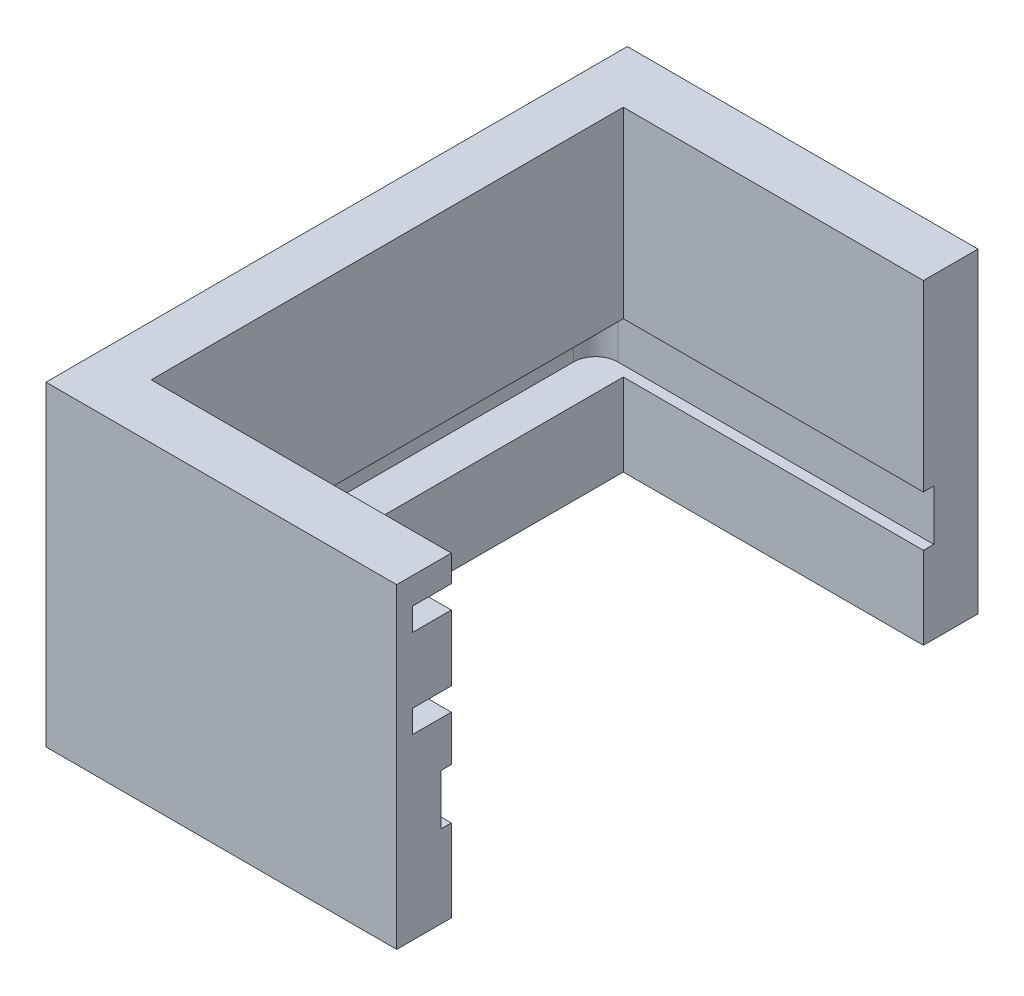
ISO-10303-21;
HEADER;
FILE_DESCRIPTION(('STEP AP214'),'2;1');
FILE_NAME('part.step','',(''),(''),'','','');
FILE_SCHEMA(('AUTOMOTIVE_DESIGN { 1 0 10303 214 1 1 1 1 }'));
ENDSEC;
DATA;
#1=APPLICATION_CONTEXT('core data for automotive mechanical design processes');
#2=APPLICATION_PROTOCOL_DEFINITION('international standard','automotive_design',2000,#1);
#3=PRODUCT_CONTEXT('',#1,'mechanical');
#4=PRODUCT('Part','Part','',(#3));
#5=PRODUCT_RELATED_PRODUCT_CATEGORY('part','',(#4));
#6=PRODUCT_DEFINITION_FORMATION('','',#4);
#7=PRODUCT_DEFINITION_CONTEXT('part definition',#1,'design');
#8=PRODUCT_DEFINITION('design','',#6,#7);
#9=PRODUCT_DEFINITION_SHAPE('','',#8);
#10=(LENGTH_UNIT() NAMED_UNIT(*) SI_UNIT(.MILLI.,.METRE.));
#11=(NAMED_UNIT(*) PLANE_ANGLE_UNIT() SI_UNIT($,.RADIAN.));
#12=(NAMED_UNIT(*) SI_UNIT($,.STERADIAN.) SOLID_ANGLE_UNIT());
#13=UNCERTAINTY_MEASURE_WITH_UNIT(LENGTH_MEASURE(1.E-05),#10,'distance_accuracy_value','');
#14=(GEOMETRIC_REPRESENTATION_CONTEXT(3) GLOBAL_UNCERTAINTY_ASSIGNED_CONTEXT((#13)) GLOBAL_UNIT_ASSIGNED_CONTEXT((#10,
#11,#12)) REPRESENTATION_CONTEXT('',''));
#15=CARTESIAN_POINT('',(0.,0.,0.));
#16=DIRECTION('',(0.,0.,1.));
#17=DIRECTION('',(1.,0.,0.));
#18=AXIS2_PLACEMENT_3D('',#15,#16,#17);
#19=CARTESIAN_POINT('',(27.75,15.9,35.3458240749704));
#20=DIRECTION('',(0.,1.,0.));
#21=DIRECTION('',(0.,0.,1.));
#22=AXIS2_PLACEMENT_3D('',#19,#20,#21);
#23=PLANE('',#22);
#24=DIRECTION('',(-1.,0.,0.));
#25=VECTOR('',#24,1.);
#26=CARTESIAN_POINT('',(27.75,15.9,44.75));
#27=LINE('',#26,#25);
#28=CARTESIAN_POINT('',(27.75,15.9,44.75));
#29=VERTEX_POINT('',#28);
#30=CARTESIAN_POINT('',(22.,15.9,44.75));
#31=VERTEX_POINT('',#30);
#32=EDGE_CURVE('E282',#29,#31,#27,.T.);
#33=ORIENTED_EDGE('',*,*,#32,.T.);
#34=DIRECTION('',(0.,0.,1.));
#35=VECTOR('',#34,1.);
#36=CARTESIAN_POINT('',(22.,15.9,35.3458240749704));
#37=LINE('',#36,#35);
#38=CARTESIAN_POINT('',(22.,15.9,41.6770956692081));
#39=VERTEX_POINT('',#38);
#40=EDGE_CURVE('E293',#39,#31,#37,.T.);
#41=ORIENTED_EDGE('',*,*,#40,.F.);
#42=DIRECTION('',(1.,0.,0.));
#43=VECTOR('',#42,1.);
#44=CARTESIAN_POINT('',(27.75,15.9,41.6770956692081));
#45=LINE('',#44,#43);
#46=CARTESIAN_POINT('',(27.75,15.9,41.6770956692081));
#47=VERTEX_POINT('',#46);
#48=EDGE_CURVE('E300',#39,#47,#45,.T.);
#49=ORIENTED_EDGE('',*,*,#48,.T.);
#50=DIRECTION('',(0.,0.,1.));
#51=VECTOR('',#50,1.);
#52=CARTESIAN_POINT('',(27.75,15.9,35.3458240749704));
#53=LINE('',#52,#51);
#54=EDGE_CURVE('E60',#47,#29,#53,.T.);
#55=ORIENTED_EDGE('',*,*,#54,.T.);
#56=EDGE_LOOP('',(#33,#41,#49,#55));
#57=FACE_BOUND('',#56,.T.);
#58=ADVANCED_FACE('F45',(#57),#23,.F.);
#59=CARTESIAN_POINT('',(27.75,14.1,35.3458240749704));
#60=DIRECTION('',(0.,-1.,0.));
#61=DIRECTION('',(0.,0.,-1.));
#62=AXIS2_PLACEMENT_3D('',#59,#60,#61);
#63=PLANE('',#62);
#64=DIRECTION('',(-1.,0.,0.));
#65=VECTOR('',#64,1.);
#66=CARTESIAN_POINT('',(27.75,14.1,41.6770956692081));
#67=LINE('',#66,#65);
#68=CARTESIAN_POINT('',(27.75,14.1,41.6770956692081));
#69=VERTEX_POINT('',#68);
#70=CARTESIAN_POINT('',(24.46,14.1,41.6770956692081));
#71=VERTEX_POINT('',#70);
#72=EDGE_CURVE('E274',#69,#71,#67,.T.);
#73=ORIENTED_EDGE('',*,*,#72,.T.);
#74=DIRECTION('',(0.,0.,-1.));
#75=VECTOR('',#74,1.);
#76=CARTESIAN_POINT('',(24.46,14.1,45.6131338250816));
#77=LINE('',#76,#75);
#78=CARTESIAN_POINT('',(24.46,14.1,44.75));
#79=VERTEX_POINT('',#78);
#80=EDGE_CURVE('E264',#79,#71,#77,.T.);
#81=ORIENTED_EDGE('',*,*,#80,.F.);
#82=DIRECTION('',(1.,0.,0.));
#83=VECTOR('',#82,1.);
#84=CARTESIAN_POINT('',(24.31,14.1,44.75));
#85=LINE('',#84,#83);
#86=CARTESIAN_POINT('',(27.75,14.1,44.75));
#87=VERTEX_POINT('',#86);
#88=EDGE_CURVE('E68',#79,#87,#85,.T.);
#89=ORIENTED_EDGE('',*,*,#88,.T.);
#90=DIRECTION('',(0.,0.,1.));
#91=VECTOR('',#90,1.);
#92=CARTESIAN_POINT('',(27.75,14.1,35.3458240749704));
#93=LINE('',#92,#91);
#94=EDGE_CURVE('E304',#69,#87,#93,.T.);
#95=ORIENTED_EDGE('',*,*,#94,.F.);
#96=EDGE_LOOP('',(#73,#81,#89,#95));
#97=FACE_BOUND('',#96,.T.);
#98=ADVANCED_FACE('F272',(#97),#63,.F.);
#99=CARTESIAN_POINT('',(24.31,13.25,35.3458240749704));
#100=DIRECTION('',(0.,-1.,0.));
#101=DIRECTION('',(0.,0.,-1.));
#102=AXIS2_PLACEMENT_3D('',#99,#100,#101);
#103=PLANE('',#102);
#104=DIRECTION('',(1.,0.,0.));
#105=VECTOR('',#104,1.);
#106=CARTESIAN_POINT('',(23.86,13.25,44.75));
#107=LINE('',#106,#105);
#108=CARTESIAN_POINT('',(23.86,13.25,44.75));
#109=VERTEX_POINT('',#108);
#110=CARTESIAN_POINT('',(24.46,13.25,44.75));
#111=VERTEX_POINT('',#110);
#112=EDGE_CURVE('E291',#109,#111,#107,.T.);
#113=ORIENTED_EDGE('',*,*,#112,.T.);
#114=DIRECTION('',(0.,0.,-1.));
#115=VECTOR('',#114,1.);
#116=CARTESIAN_POINT('',(24.46,13.25,45.6131338250816));
#117=LINE('',#116,#115);
#118=CARTESIAN_POINT('',(24.46,13.25,41.6770956692081));
#119=VERTEX_POINT('',#118);
#120=EDGE_CURVE('E267',#111,#119,#117,.T.);
#121=ORIENTED_EDGE('',*,*,#120,.T.);
#122=DIRECTION('',(-1.,0.,0.));
#123=VECTOR('',#122,1.);
#124=CARTESIAN_POINT('',(24.31,13.25,41.6770956692081));
#125=LINE('',#124,#123);
#126=CARTESIAN_POINT('',(23.86,13.25,41.6770956692081));
#127=VERTEX_POINT('',#126);
#128=EDGE_CURVE('E297',#119,#127,#125,.T.);
#129=ORIENTED_EDGE('',*,*,#128,.T.);
#130=DIRECTION('',(0.,0.,1.));
#131=VECTOR('',#130,1.);
#132=CARTESIAN_POINT('',(23.86,13.25,35.3458240749704));
#133=LINE('',#132,#131);
#134=EDGE_CURVE('E306',#127,#109,#133,.T.);
#135=ORIENTED_EDGE('',*,*,#134,.T.);
#136=EDGE_LOOP('',(#113,#121,#129,#135));
#137=FACE_BOUND('',#136,.T.);
#138=ADVANCED_FACE('F630',(#137),#103,.F.);
#139=CARTESIAN_POINT('',(23.86,13.25,35.3458240749704));
#140=DIRECTION('',(-0.41564419471729,-0.909527296675484,0.));
#141=DIRECTION('',(0.909527296675485,-0.415644194717291,0.));
#142=AXIS2_PLACEMENT_3D('',#139,#140,#141);
#143=PLANE('',#142);
#144=DIRECTION('',(0.909527296675485,-0.415644194717291,0.));
#145=VECTOR('',#144,1.);
#146=CARTESIAN_POINT('',(22.,14.1,44.75));
#147=LINE('',#146,#145);
#148=CARTESIAN_POINT('',(22.,14.1,44.75));
#149=VERTEX_POINT('',#148);
#150=EDGE_CURVE('E289',#149,#109,#147,.T.);
#151=ORIENTED_EDGE('',*,*,#150,.T.);
#152=ORIENTED_EDGE('',*,*,#134,.F.);
#153=DIRECTION('',(-0.909527296675485,0.415644194717291,0.));
#154=VECTOR('',#153,1.);
#155=CARTESIAN_POINT('',(23.86,13.25,41.6770956692081));
#156=LINE('',#155,#154);
#157=CARTESIAN_POINT('',(22.,14.1,41.6770956692081));
#158=VERTEX_POINT('',#157);
#159=EDGE_CURVE('E294',#127,#158,#156,.T.);
#160=ORIENTED_EDGE('',*,*,#159,.T.);
#161=DIRECTION('',(0.,0.,1.));
#162=VECTOR('',#161,1.);
#163=CARTESIAN_POINT('',(22.,14.1,35.3458240749704));
#164=LINE('',#163,#162);
#165=EDGE_CURVE('E309',#158,#149,#164,.T.);
#166=ORIENTED_EDGE('',*,*,#165,.T.);
#167=EDGE_LOOP('',(#151,#152,#160,#166));
#168=FACE_BOUND('',#167,.T.);
#169=ADVANCED_FACE('F637',(#168),#143,.F.);
#170=CARTESIAN_POINT('',(22.,15.9,35.3458240749704));
#171=DIRECTION('',(-1.,0.,0.));
#172=DIRECTION('',(0.,0.,1.));
#173=AXIS2_PLACEMENT_3D('',#170,#171,#172);
#174=PLANE('',#173);
#175=DIRECTION('',(0.,-1.,0.));
#176=VECTOR('',#175,1.);
#177=CARTESIAN_POINT('',(22.,15.9,44.75));
#178=LINE('',#177,#176);
#179=EDGE_CURVE('E287',#31,#149,#178,.T.);
#180=ORIENTED_EDGE('',*,*,#179,.T.);
#181=ORIENTED_EDGE('',*,*,#165,.F.);
#182=DIRECTION('',(0.,1.,0.));
#183=VECTOR('',#182,1.);
#184=CARTESIAN_POINT('',(22.,15.9,41.6770956692081));
#185=LINE('',#184,#183);
#186=EDGE_CURVE('E302',#158,#39,#185,.T.);
#187=ORIENTED_EDGE('',*,*,#186,.T.);
#188=ORIENTED_EDGE('',*,*,#40,.T.);
#189=EDGE_LOOP('',(#180,#181,#187,#188));
#190=FACE_BOUND('',#189,.T.);
#191=ADVANCED_FACE('F641',(#190),#174,.F.);
#192=CARTESIAN_POINT('',(27.75,22.9,35.3458240749704));
#193=DIRECTION('',(0.,1.,0.));
#194=DIRECTION('',(0.,0.,1.));
#195=AXIS2_PLACEMENT_3D('',#192,#193,#194);
#196=PLANE('',#195);
#197=DIRECTION('',(-1.,0.,0.));
#198=VECTOR('',#197,1.);
#199=CARTESIAN_POINT('',(27.75,22.9,44.75));
#200=LINE('',#199,#198);
#201=CARTESIAN_POINT('',(27.75,22.9,44.75));
#202=VERTEX_POINT('',#201);
#203=CARTESIAN_POINT('',(22.,22.9,44.75));
#204=VERTEX_POINT('',#203);
#205=EDGE_CURVE('E331',#202,#204,#200,.T.);
#206=ORIENTED_EDGE('',*,*,#205,.T.);
#207=DIRECTION('',(0.,0.,1.));
#208=VECTOR('',#207,1.);
#209=CARTESIAN_POINT('',(22.,22.9,35.3458240749704));
#210=LINE('',#209,#208);
#211=CARTESIAN_POINT('',(22.,22.9,41.6770956692081));
#212=VERTEX_POINT('',#211);
#213=EDGE_CURVE('E339',#212,#204,#210,.T.);
#214=ORIENTED_EDGE('',*,*,#213,.F.);
#215=DIRECTION('',(1.,0.,0.));
#216=VECTOR('',#215,1.);
#217=CARTESIAN_POINT('',(27.75,22.9,41.6770956692081));
#218=LINE('',#217,#216);
#219=CARTESIAN_POINT('',(27.75,22.9,41.6770956692081));
#220=VERTEX_POINT('',#219);
#221=EDGE_CURVE('E349',#212,#220,#218,.T.);
#222=ORIENTED_EDGE('',*,*,#221,.T.);
#223=DIRECTION('',(0.,0.,1.));
#224=VECTOR('',#223,1.);
#225=CARTESIAN_POINT('',(27.75,22.9,35.3458240749704));
#226=LINE('',#225,#224);
#227=EDGE_CURVE('E344',#220,#202,#226,.T.);
#228=ORIENTED_EDGE('',*,*,#227,.T.);
#229=EDGE_LOOP('',(#206,#214,#222,#228));
#230=FACE_BOUND('',#229,.T.);
#231=ADVANCED_FACE('F606',(#230),#196,.F.);
#232=CARTESIAN_POINT('',(27.75,21.1,35.3458240749704));
#233=DIRECTION('',(0.,-1.,0.));
#234=DIRECTION('',(0.,0.,-1.));
#235=AXIS2_PLACEMENT_3D('',#232,#233,#234);
#236=PLANE('',#235);
#237=DIRECTION('',(-1.,0.,0.));
#238=VECTOR('',#237,1.);
#239=CARTESIAN_POINT('',(27.75,21.1,41.6770956692081));
#240=LINE('',#239,#238);
#241=CARTESIAN_POINT('',(27.75,21.1,41.6770956692081));
#242=VERTEX_POINT('',#241);
#243=CARTESIAN_POINT('',(24.46,21.1,41.6770956692081));
#244=VERTEX_POINT('',#243);
#245=EDGE_CURVE('E346',#242,#244,#240,.T.);
#246=ORIENTED_EDGE('',*,*,#245,.T.);
#247=DIRECTION('',(0.,0.,-1.));
#248=VECTOR('',#247,1.);
#249=CARTESIAN_POINT('',(24.46,21.1,45.6131338250816));
#250=LINE('',#249,#248);
#251=CARTESIAN_POINT('',(24.46,21.1,44.75));
#252=VERTEX_POINT('',#251);
#253=EDGE_CURVE('E318',#252,#244,#250,.T.);
#254=ORIENTED_EDGE('',*,*,#253,.F.);
#255=DIRECTION('',(1.,0.,0.));
#256=VECTOR('',#255,1.);
#257=CARTESIAN_POINT('',(24.31,21.1,44.75));
#258=LINE('',#257,#256);
#259=CARTESIAN_POINT('',(27.75,21.1,44.75));
#260=VERTEX_POINT('',#259);
#261=EDGE_CURVE('E325',#252,#260,#258,.T.);
#262=ORIENTED_EDGE('',*,*,#261,.T.);
#263=DIRECTION('',(0.,0.,1.));
#264=VECTOR('',#263,1.);
#265=CARTESIAN_POINT('',(27.75,21.1,35.3458240749704));
#266=LINE('',#265,#264);
#267=EDGE_CURVE('E353',#242,#260,#266,.T.);
#268=ORIENTED_EDGE('',*,*,#267,.F.);
#269=EDGE_LOOP('',(#246,#254,#262,#268));
#270=FACE_BOUND('',#269,.T.);
#271=ADVANCED_FACE('F590',(#270),#236,.F.);
#272=CARTESIAN_POINT('',(24.31,20.25,35.3458240749704));
#273=DIRECTION('',(0.,-1.,0.));
#274=DIRECTION('',(0.,0.,-1.));
#275=AXIS2_PLACEMENT_3D('',#272,#273,#274);
#276=PLANE('',#275);
#277=DIRECTION('',(1.,0.,0.));
#278=VECTOR('',#277,1.);
#279=CARTESIAN_POINT('',(23.86,20.25,44.75));
#280=LINE('',#279,#278);
#281=CARTESIAN_POINT('',(23.86,20.25,44.75));
#282=VERTEX_POINT('',#281);
#283=CARTESIAN_POINT('',(24.46,20.25,44.75));
#284=VERTEX_POINT('',#283);
#285=EDGE_CURVE('E337',#282,#284,#280,.T.);
#286=ORIENTED_EDGE('',*,*,#285,.T.);
#287=DIRECTION('',(0.,0.,-1.));
#288=VECTOR('',#287,1.);
#289=CARTESIAN_POINT('',(24.46,20.25,45.6131338250816));
#290=LINE('',#289,#288);
#291=CARTESIAN_POINT('',(24.46,20.25,41.6770956692081));
#292=VERTEX_POINT('',#291);
#293=EDGE_CURVE('E322',#284,#292,#290,.T.);
#294=ORIENTED_EDGE('',*,*,#293,.T.);
#295=DIRECTION('',(-1.,0.,0.));
#296=VECTOR('',#295,1.);
#297=CARTESIAN_POINT('',(24.31,20.25,41.6770956692081));
#298=LINE('',#297,#296);
#299=CARTESIAN_POINT('',(23.86,20.25,41.6770956692081));
#300=VERTEX_POINT('',#299);
#301=EDGE_CURVE('E343',#292,#300,#298,.T.);
#302=ORIENTED_EDGE('',*,*,#301,.T.);
#303=DIRECTION('',(0.,0.,1.));
#304=VECTOR('',#303,1.);
#305=CARTESIAN_POINT('',(23.86,20.25,35.3458240749704));
#306=LINE('',#305,#304);
#307=EDGE_CURVE('E356',#300,#282,#306,.T.);
#308=ORIENTED_EDGE('',*,*,#307,.T.);
#309=EDGE_LOOP('',(#286,#294,#302,#308));
#310=FACE_BOUND('',#309,.T.);
#311=ADVANCED_FACE('F614',(#310),#276,.F.);
#312=CARTESIAN_POINT('',(23.86,20.25,35.3458240749704));
#313=DIRECTION('',(-0.41564419471729,-0.909527296675484,0.));
#314=DIRECTION('',(0.909527296675485,-0.415644194717291,0.));
#315=AXIS2_PLACEMENT_3D('',#312,#313,#314);
#316=PLANE('',#315);
#317=DIRECTION('',(0.909527296675485,-0.415644194717291,0.));
#318=VECTOR('',#317,1.);
#319=CARTESIAN_POINT('',(22.,21.1,44.75));
#320=LINE('',#319,#318);
#321=CARTESIAN_POINT('',(22.,21.1,44.75));
#322=VERTEX_POINT('',#321);
#323=EDGE_CURVE('E335',#322,#282,#320,.T.);
#324=ORIENTED_EDGE('',*,*,#323,.T.);
#325=ORIENTED_EDGE('',*,*,#307,.F.);
#326=DIRECTION('',(-0.909527296675485,0.415644194717291,0.));
#327=VECTOR('',#326,1.);
#328=CARTESIAN_POINT('',(23.86,20.25,41.6770956692081));
#329=LINE('',#328,#327);
#330=CARTESIAN_POINT('',(22.,21.1,41.6770956692081));
#331=VERTEX_POINT('',#330);
#332=EDGE_CURVE('E340',#300,#331,#329,.T.);
#333=ORIENTED_EDGE('',*,*,#332,.T.);
#334=DIRECTION('',(0.,0.,1.));
#335=VECTOR('',#334,1.);
#336=CARTESIAN_POINT('',(22.,21.1,35.3458240749704));
#337=LINE('',#336,#335);
#338=EDGE_CURVE('E359',#331,#322,#337,.T.);
#339=ORIENTED_EDGE('',*,*,#338,.T.);
#340=EDGE_LOOP('',(#324,#325,#333,#339));
#341=FACE_BOUND('',#340,.T.);
#342=ADVANCED_FACE('F612',(#341),#316,.F.);
#343=CARTESIAN_POINT('',(22.,22.9,35.3458240749704));
#344=DIRECTION('',(-1.,0.,0.));
#345=DIRECTION('',(0.,0.,1.));
#346=AXIS2_PLACEMENT_3D('',#343,#344,#345);
#347=PLANE('',#346);
#348=DIRECTION('',(0.,-1.,0.));
#349=VECTOR('',#348,1.);
#350=CARTESIAN_POINT('',(22.,22.9,44.75));
#351=LINE('',#350,#349);
#352=EDGE_CURVE('E333',#204,#322,#351,.T.);
#353=ORIENTED_EDGE('',*,*,#352,.T.);
#354=ORIENTED_EDGE('',*,*,#338,.F.);
#355=DIRECTION('',(0.,1.,0.));
#356=VECTOR('',#355,1.);
#357=CARTESIAN_POINT('',(22.,22.9,41.6770956692081));
#358=LINE('',#357,#356);
#359=EDGE_CURVE('E351',#331,#212,#358,.T.);
#360=ORIENTED_EDGE('',*,*,#359,.T.);
#361=ORIENTED_EDGE('',*,*,#213,.T.);
#362=EDGE_LOOP('',(#353,#354,#360,#361));
#363=FACE_BOUND('',#362,.T.);
#364=ADVANCED_FACE('F608',(#363),#347,.F.);
#365=CARTESIAN_POINT('',(4.,0.,46.));
#366=DIRECTION('',(-1.,0.,0.));
#367=DIRECTION('',(0.,0.,1.));
#368=AXIS2_PLACEMENT_3D('',#365,#366,#367);
#369=PLANE('',#368);
#370=DIRECTION('',(0.,0.,1.));
#371=VECTOR('',#370,1.);
#372=CARTESIAN_POINT('',(4.,10.5115762542506,46.));
#373=LINE('',#372,#371);
#374=CARTESIAN_POINT('',(4.,10.5115762542506,4.31897182601304));
#375=VERTEX_POINT('',#374);
#376=CARTESIAN_POINT('',(4.,10.5115762542506,41.677095669208));
#377=VERTEX_POINT('',#376);
#378=EDGE_CURVE('E448',#375,#377,#373,.T.);
#379=ORIENTED_EDGE('',*,*,#378,.F.);
#380=DIRECTION('',(0.,1.,0.));
#381=VECTOR('',#380,1.);
#382=CARTESIAN_POINT('',(4.,-24.2307736156058,4.31897182601304));
#383=LINE('',#382,#381);
#384=CARTESIAN_POINT('',(4.,25.,4.31897182601304));
#385=VERTEX_POINT('',#384);
#386=EDGE_CURVE('E458',#375,#385,#383,.T.);
#387=ORIENTED_EDGE('',*,*,#386,.T.);
#388=DIRECTION('',(0.,0.,-1.));
#389=VECTOR('',#388,1.);
#390=CARTESIAN_POINT('',(4.,25.,46.));
#391=LINE('',#390,#389);
#392=CARTESIAN_POINT('',(4.,25.,41.677095669208));
#393=VERTEX_POINT('',#392);
#394=EDGE_CURVE('E497',#393,#385,#391,.T.);
#395=ORIENTED_EDGE('',*,*,#394,.F.);
#396=DIRECTION('',(0.,1.,0.));
#397=VECTOR('',#396,1.);
#398=CARTESIAN_POINT('',(4.,-23.7548500310989,41.677095669208));
#399=LINE('',#398,#397);
#400=EDGE_CURVE('E390',#377,#393,#399,.T.);
#401=ORIENTED_EDGE('',*,*,#400,.F.);
#402=EDGE_LOOP('',(#379,#387,#395,#401));
#403=FACE_BOUND('',#402,.T.);
#404=ADVANCED_FACE('F527',(#403),#369,.F.);
#405=CARTESIAN_POINT('',(27.75,-24.2307736156058,4.31897182601304));
#406=DIRECTION('',(0.,0.,1.));
#407=DIRECTION('',(1.,0.,0.));
#408=AXIS2_PLACEMENT_3D('',#405,#406,#407);
#409=PLANE('',#408);
#410=ORIENTED_EDGE('',*,*,#386,.F.);
#411=DIRECTION('',(1.,0.,0.));
#412=VECTOR('',#411,1.);
#413=CARTESIAN_POINT('',(27.75,10.5115762542506,4.31897182601304));
#414=LINE('',#413,#412);
#415=CARTESIAN_POINT('',(27.75,10.5115762542506,4.31897182601304));
#416=VERTEX_POINT('',#415);
#417=EDGE_CURVE('E53',#375,#416,#414,.T.);
#418=ORIENTED_EDGE('',*,*,#417,.T.);
#419=DIRECTION('',(0.,1.,0.));
#420=VECTOR('',#419,1.);
#421=CARTESIAN_POINT('',(27.75,-24.2307736156058,4.31897182601304));
#422=LINE('',#421,#420);
#423=CARTESIAN_POINT('',(27.75,25.,4.31897182601304));
#424=VERTEX_POINT('',#423);
#425=EDGE_CURVE('E462',#416,#424,#422,.T.);
#426=ORIENTED_EDGE('',*,*,#425,.T.);
#427=DIRECTION('',(1.,0.,0.));
#428=VECTOR('',#427,1.);
#429=CARTESIAN_POINT('',(27.75,25.,4.31897182601304));
#430=LINE('',#429,#428);
#431=EDGE_CURVE('E465',#385,#424,#430,.T.);
#432=ORIENTED_EDGE('',*,*,#431,.F.);
#433=EDGE_LOOP('',(#410,#418,#426,#432));
#434=FACE_BOUND('',#433,.T.);
#435=ADVANCED_FACE('F510',(#434),#409,.T.);
#436=CARTESIAN_POINT('',(4.,0.,4.31897182601304));
#437=VERTEX_POINT('',#436);
#438=CARTESIAN_POINT('',(4.,6.51157625425061,4.31897182601304));
#439=VERTEX_POINT('',#438);
#440=EDGE_CURVE('E455',#437,#439,#383,.T.);
#441=ORIENTED_EDGE('',*,*,#440,.T.);
#442=DIRECTION('',(0.,0.,1.));
#443=VECTOR('',#442,1.);
#444=CARTESIAN_POINT('',(4.,6.51157625425062,46.));
#445=LINE('',#444,#443);
#446=CARTESIAN_POINT('',(4.,6.51157625425062,41.677095669208));
#447=VERTEX_POINT('',#446);
#448=EDGE_CURVE('E446',#439,#447,#445,.T.);
#449=ORIENTED_EDGE('',*,*,#448,.T.);
#450=CARTESIAN_POINT('',(4.,0.,41.677095669208));
#451=VERTEX_POINT('',#450);
#452=EDGE_CURVE('E395',#451,#447,#399,.T.);
#453=ORIENTED_EDGE('',*,*,#452,.F.);
#454=DIRECTION('',(0.,0.,-1.));
#455=VECTOR('',#454,1.);
#456=CARTESIAN_POINT('',(4.,0.,46.));
#457=LINE('',#456,#455);
#458=EDGE_CURVE('E500',#451,#437,#457,.T.);
#459=ORIENTED_EDGE('',*,*,#458,.T.);
#460=EDGE_LOOP('',(#441,#449,#453,#459));
#461=FACE_BOUND('',#460,.T.);
#462=ADVANCED_FACE('F839',(#461),#369,.F.);
#463=CARTESIAN_POINT('',(0.,0.,46.));
#464=DIRECTION('',(1.,0.,0.));
#465=DIRECTION('',(0.,0.,-1.));
#466=AXIS2_PLACEMENT_3D('',#463,#464,#465);
#467=PLANE('',#466);
#468=DIRECTION('',(0.,-1.,0.));
#469=VECTOR('',#468,1.);
#470=CARTESIAN_POINT('',(0.,0.,0.));
#471=LINE('',#470,#469);
#472=CARTESIAN_POINT('',(0.,25.,0.));
#473=VERTEX_POINT('',#472);
#474=CARTESIAN_POINT('',(0.,0.,0.));
#475=VERTEX_POINT('',#474);
#476=EDGE_CURVE('E475',#473,#475,#471,.T.);
#477=ORIENTED_EDGE('',*,*,#476,.T.);
#478=DIRECTION('',(0.,0.,-1.));
#479=VECTOR('',#478,1.);
#480=CARTESIAN_POINT('',(0.,0.,46.));
#481=LINE('',#480,#479);
#482=CARTESIAN_POINT('',(0.,0.,46.));
#483=VERTEX_POINT('',#482);
#484=EDGE_CURVE('E502',#483,#475,#481,.T.);
#485=ORIENTED_EDGE('',*,*,#484,.F.);
#486=DIRECTION('',(0.,-1.,0.));
#487=VECTOR('',#486,1.);
#488=CARTESIAN_POINT('',(0.,0.,46.));
#489=LINE('',#488,#487);
#490=CARTESIAN_POINT('',(0.,25.,46.));
#491=VERTEX_POINT('',#490);
#492=EDGE_CURVE('E480',#491,#483,#489,.T.);
#493=ORIENTED_EDGE('',*,*,#492,.F.);
#494=DIRECTION('',(0.,0.,-1.));
#495=VECTOR('',#494,1.);
#496=CARTESIAN_POINT('',(0.,25.,46.));
#497=LINE('',#496,#495);
#498=EDGE_CURVE('E489',#491,#473,#497,.T.);
#499=ORIENTED_EDGE('',*,*,#498,.T.);
#500=EDGE_LOOP('',(#477,#485,#493,#499));
#501=FACE_BOUND('',#500,.T.);
#502=ADVANCED_FACE('F47',(#501),#467,.F.);
#503=CARTESIAN_POINT('',(0.,0.,46.));
#504=DIRECTION('',(0.,1.,0.));
#505=DIRECTION('',(0.,0.,1.));
#506=AXIS2_PLACEMENT_3D('',#503,#504,#505);
#507=PLANE('',#506);
#508=ORIENTED_EDGE('',*,*,#458,.F.);
#509=DIRECTION('',(-1.,0.,0.));
#510=VECTOR('',#509,1.);
#511=CARTESIAN_POINT('',(27.75,0.,41.6770956692081));
#512=LINE('',#511,#510);
#513=CARTESIAN_POINT('',(27.75,0.,41.6770956692081));
#514=VERTEX_POINT('',#513);
#515=EDGE_CURVE('E383',#514,#451,#512,.T.);
#516=ORIENTED_EDGE('',*,*,#515,.F.);
#517=DIRECTION('',(0.,0.,1.));
#518=VECTOR('',#517,1.);
#519=CARTESIAN_POINT('',(27.75,0.,46.));
#520=LINE('',#519,#518);
#521=CARTESIAN_POINT('',(27.75,0.,46.));
#522=VERTEX_POINT('',#521);
#523=EDGE_CURVE('E473',#514,#522,#520,.T.);
#524=ORIENTED_EDGE('',*,*,#523,.T.);
#525=DIRECTION('',(1.,0.,0.));
#526=VECTOR('',#525,1.);
#527=CARTESIAN_POINT('',(0.,0.,46.));
#528=LINE('',#527,#526);
#529=EDGE_CURVE('E483',#483,#522,#528,.T.);
#530=ORIENTED_EDGE('',*,*,#529,.F.);
#531=ORIENTED_EDGE('',*,*,#484,.T.);
#532=DIRECTION('',(1.,0.,0.));
#533=VECTOR('',#532,1.);
#534=CARTESIAN_POINT('',(0.,0.,0.));
#535=LINE('',#534,#533);
#536=CARTESIAN_POINT('',(27.75,0.,0.));
#537=VERTEX_POINT('',#536);
#538=EDGE_CURVE('E492',#475,#537,#535,.T.);
#539=ORIENTED_EDGE('',*,*,#538,.T.);
#540=DIRECTION('',(0.,0.,1.));
#541=VECTOR('',#540,1.);
#542=CARTESIAN_POINT('',(27.75,0.,3.49999999999997));
#543=LINE('',#542,#541);
#544=CARTESIAN_POINT('',(27.75,0.,4.31897182601304));
#545=VERTEX_POINT('',#544);
#546=EDGE_CURVE('E450',#537,#545,#543,.T.);
#547=ORIENTED_EDGE('',*,*,#546,.T.);
#548=DIRECTION('',(-1.,0.,0.));
#549=VECTOR('',#548,1.);
#550=CARTESIAN_POINT('',(27.75,0.,4.31897182601304));
#551=LINE('',#550,#549);
#552=EDGE_CURVE('E470',#545,#437,#551,.T.);
#553=ORIENTED_EDGE('',*,*,#552,.T.);
#554=EDGE_LOOP('',(#508,#516,#524,#530,#531,#539,#547,#553));
#555=FACE_BOUND('',#554,.T.);
#556=ADVANCED_FACE('F569',(#555),#507,.F.);
#557=CARTESIAN_POINT('',(0.,25.,46.));
#558=DIRECTION('',(0.,-1.,0.));
#559=DIRECTION('',(0.,0.,-1.));
#560=AXIS2_PLACEMENT_3D('',#557,#558,#559);
#561=PLANE('',#560);
#562=DIRECTION('',(0.,0.,-1.));
#563=VECTOR('',#562,1.);
#564=CARTESIAN_POINT('',(27.75,25.,46.));
#565=LINE('',#564,#563);
#566=CARTESIAN_POINT('',(27.75,25.,46.));
#567=VERTEX_POINT('',#566);
#568=CARTESIAN_POINT('',(27.75,25.,41.6770956692081));
#569=VERTEX_POINT('',#568);
#570=EDGE_CURVE('E468',#567,#569,#565,.T.);
#571=ORIENTED_EDGE('',*,*,#570,.T.);
#572=DIRECTION('',(1.,0.,0.));
#573=VECTOR('',#572,1.);
#574=CARTESIAN_POINT('',(27.75,25.,41.6770956692081));
#575=LINE('',#574,#573);
#576=EDGE_CURVE('E380',#393,#569,#575,.T.);
#577=ORIENTED_EDGE('',*,*,#576,.F.);
#578=ORIENTED_EDGE('',*,*,#394,.T.);
#579=ORIENTED_EDGE('',*,*,#431,.T.);
#580=DIRECTION('',(0.,0.,-1.));
#581=VECTOR('',#580,1.);
#582=CARTESIAN_POINT('',(27.75,25.,3.49999999999997));
#583=LINE('',#582,#581);
#584=CARTESIAN_POINT('',(27.75,25.,0.));
#585=VERTEX_POINT('',#584);
#586=EDGE_CURVE('E454',#424,#585,#583,.T.);
#587=ORIENTED_EDGE('',*,*,#586,.T.);
#588=DIRECTION('',(-1.,0.,0.));
#589=VECTOR('',#588,1.);
#590=CARTESIAN_POINT('',(0.,25.,0.));
#591=LINE('',#590,#589);
#592=EDGE_CURVE('E484',#585,#473,#591,.T.);
#593=ORIENTED_EDGE('',*,*,#592,.T.);
#594=ORIENTED_EDGE('',*,*,#498,.F.);
#595=DIRECTION('',(-1.,0.,0.));
#596=VECTOR('',#595,1.);
#597=CARTESIAN_POINT('',(0.,25.,46.));
#598=LINE('',#597,#596);
#599=EDGE_CURVE('E487',#567,#491,#598,.T.);
#600=ORIENTED_EDGE('',*,*,#599,.F.);
#601=EDGE_LOOP('',(#571,#577,#578,#579,#587,#593,#594,#600));
#602=FACE_BOUND('',#601,.T.);
#603=ADVANCED_FACE('F521',(#602),#561,.F.);
#604=CARTESIAN_POINT('',(0.,0.,46.));
#605=DIRECTION('',(0.,0.,-1.));
#606=DIRECTION('',(-1.,0.,0.));
#607=AXIS2_PLACEMENT_3D('',#604,#605,#606);
#608=PLANE('',#607);
#609=DIRECTION('',(0.,1.,0.));
#610=VECTOR('',#609,1.);
#611=CARTESIAN_POINT('',(27.75,-24.2307736156058,46.));
#612=LINE('',#611,#610);
#613=EDGE_CURVE('E476',#522,#567,#612,.T.);
#614=ORIENTED_EDGE('',*,*,#613,.T.);
#615=ORIENTED_EDGE('',*,*,#599,.T.);
#616=ORIENTED_EDGE('',*,*,#492,.T.);
#617=ORIENTED_EDGE('',*,*,#529,.T.);
#618=EDGE_LOOP('',(#614,#615,#616,#617));
#619=FACE_BOUND('',#618,.T.);
#620=ADVANCED_FACE('F728',(#619),#608,.F.);
#621=CARTESIAN_POINT('',(0.,0.,0.));
#622=DIRECTION('',(0.,0.,-1.));
#623=DIRECTION('',(-1.,0.,0.));
#624=AXIS2_PLACEMENT_3D('',#621,#622,#623);
#625=PLANE('',#624);
#626=ORIENTED_EDGE('',*,*,#476,.F.);
#627=ORIENTED_EDGE('',*,*,#592,.F.);
#628=DIRECTION('',(0.,1.,0.));
#629=VECTOR('',#628,1.);
#630=CARTESIAN_POINT('',(27.75,-24.2307736156058,0.));
#631=LINE('',#630,#629);
#632=EDGE_CURVE('E451',#537,#585,#631,.T.);
#633=ORIENTED_EDGE('',*,*,#632,.F.);
#634=ORIENTED_EDGE('',*,*,#538,.F.);
#635=EDGE_LOOP('',(#626,#627,#633,#634));
#636=FACE_BOUND('',#635,.T.);
#637=ADVANCED_FACE('F573',(#636),#625,.T.);
#638=CARTESIAN_POINT('',(27.75,-24.2307736156058,46.));
#639=DIRECTION('',(1.,0.,0.));
#640=DIRECTION('',(0.,0.,-1.));
#641=AXIS2_PLACEMENT_3D('',#638,#639,#640);
#642=PLANE('',#641);
#643=ORIENTED_EDGE('',*,*,#94,.T.);
#644=DIRECTION('',(0.,1.,0.));
#645=VECTOR('',#644,1.);
#646=CARTESIAN_POINT('',(27.75,14.1,44.75));
#647=LINE('',#646,#645);
#648=EDGE_CURVE('E280',#87,#29,#647,.T.);
#649=ORIENTED_EDGE('',*,*,#648,.T.);
#650=ORIENTED_EDGE('',*,*,#54,.F.);
#651=DIRECTION('',(0.,1.,0.));
#652=VECTOR('',#651,1.);
#653=CARTESIAN_POINT('',(27.75,-23.7548500310989,41.6770956692081));
#654=LINE('',#653,#652);
#655=EDGE_CURVE('E394',#47,#242,#654,.T.);
#656=ORIENTED_EDGE('',*,*,#655,.T.);
#657=ORIENTED_EDGE('',*,*,#267,.T.);
#658=DIRECTION('',(0.,1.,0.));
#659=VECTOR('',#658,1.);
#660=CARTESIAN_POINT('',(27.75,21.1,44.75));
#661=LINE('',#660,#659);
#662=EDGE_CURVE('E328',#260,#202,#661,.T.);
#663=ORIENTED_EDGE('',*,*,#662,.T.);
#664=ORIENTED_EDGE('',*,*,#227,.F.);
#665=EDGE_CURVE('E398',#220,#569,#654,.T.);
#666=ORIENTED_EDGE('',*,*,#665,.T.);
#667=ORIENTED_EDGE('',*,*,#570,.F.);
#668=ORIENTED_EDGE('',*,*,#613,.F.);
#669=ORIENTED_EDGE('',*,*,#523,.F.);
#670=CARTESIAN_POINT('',(27.75,6.51157625425062,41.6770956692081));
#671=VERTEX_POINT('',#670);
#672=EDGE_CURVE('E387',#514,#671,#654,.T.);
#673=ORIENTED_EDGE('',*,*,#672,.T.);
#674=DIRECTION('',(0.,0.,-1.));
#675=VECTOR('',#674,1.);
#676=CARTESIAN_POINT('',(27.75,6.51157625425062,42.));
#677=LINE('',#676,#675);
#678=CARTESIAN_POINT('',(27.75,6.51157625425062,42.5000000000005));
#679=VERTEX_POINT('',#678);
#680=EDGE_CURVE('E418',#679,#671,#677,.T.);
#681=ORIENTED_EDGE('',*,*,#680,.F.);
#682=DIRECTION('',(0.,-1.,0.));
#683=VECTOR('',#682,1.);
#684=CARTESIAN_POINT('',(27.75,10.5115762542508,42.5000000000005));
#685=LINE('',#684,#683);
#686=CARTESIAN_POINT('',(27.75,10.5115762542508,42.5000000000005));
#687=VERTEX_POINT('',#686);
#688=EDGE_CURVE('E365',#687,#679,#685,.T.);
#689=ORIENTED_EDGE('',*,*,#688,.F.);
#690=DIRECTION('',(0.,0.,-1.));
#691=VECTOR('',#690,1.);
#692=CARTESIAN_POINT('',(27.75,10.5115762542506,42.));
#693=LINE('',#692,#691);
#694=CARTESIAN_POINT('',(27.75,10.5115762542506,41.6770956692081));
#695=VERTEX_POINT('',#694);
#696=EDGE_CURVE('E405',#687,#695,#693,.T.);
#697=ORIENTED_EDGE('',*,*,#696,.T.);
#698=EDGE_CURVE('E393',#695,#69,#654,.T.);
#699=ORIENTED_EDGE('',*,*,#698,.T.);
#700=EDGE_LOOP('',(#643,#649,#650,#656,#657,#663,#664,#666,#667,#668,#669,#673,#681,#689,#697,#699));
#701=FACE_BOUND('',#700,.T.);
#702=ADVANCED_FACE('F536',(#701),#642,.T.);
#703=CARTESIAN_POINT('',(27.75,-24.2307736156058,3.49999999999997));
#704=DIRECTION('',(1.,0.,0.));
#705=DIRECTION('',(0.,0.,-1.));
#706=AXIS2_PLACEMENT_3D('',#703,#704,#705);
#707=PLANE('',#706);
#708=DIRECTION('',(0.,0.,-1.));
#709=VECTOR('',#708,1.);
#710=CARTESIAN_POINT('',(27.75,6.51157625425062,25.8053781344547));
#711=LINE('',#710,#709);
#712=CARTESIAN_POINT('',(27.75,6.51157625425062,4.31897182601304));
#713=VERTEX_POINT('',#712);
#714=CARTESIAN_POINT('',(27.75,6.51157625425062,3.49999999999997));
#715=VERTEX_POINT('',#714);
#716=EDGE_CURVE('E421',#713,#715,#711,.T.);
#717=ORIENTED_EDGE('',*,*,#716,.F.);
#718=EDGE_CURVE('E459',#545,#713,#422,.T.);
#719=ORIENTED_EDGE('',*,*,#718,.F.);
#720=ORIENTED_EDGE('',*,*,#546,.F.);
#721=ORIENTED_EDGE('',*,*,#632,.T.);
#722=ORIENTED_EDGE('',*,*,#586,.F.);
#723=ORIENTED_EDGE('',*,*,#425,.F.);
#724=DIRECTION('',(0.,0.,-1.));
#725=VECTOR('',#724,1.);
#726=CARTESIAN_POINT('',(27.75,10.5115762542506,25.8053781344547));
#727=LINE('',#726,#725);
#728=CARTESIAN_POINT('',(27.75,10.5115762542506,3.49999999999997));
#729=VERTEX_POINT('',#728);
#730=EDGE_CURVE('E409',#416,#729,#727,.T.);
#731=ORIENTED_EDGE('',*,*,#730,.T.);
#732=DIRECTION('',(0.,-1.,0.));
#733=VECTOR('',#732,1.);
#734=CARTESIAN_POINT('',(27.75,10.5115762542506,3.49999999999997));
#735=LINE('',#734,#733);
#736=EDGE_CURVE('E415',#729,#715,#735,.T.);
#737=ORIENTED_EDGE('',*,*,#736,.T.);
#738=EDGE_LOOP('',(#717,#719,#720,#721,#722,#723,#731,#737));
#739=FACE_BOUND('',#738,.T.);
#740=ADVANCED_FACE('F517',(#739),#707,.T.);
#741=DIRECTION('',(1.,0.,0.));
#742=VECTOR('',#741,1.);
#743=CARTESIAN_POINT('',(27.75,6.51157625425062,4.31897182601304));
#744=LINE('',#743,#742);
#745=EDGE_CURVE('E505',#439,#713,#744,.T.);
#746=ORIENTED_EDGE('',*,*,#745,.F.);
#747=ORIENTED_EDGE('',*,*,#440,.F.);
#748=ORIENTED_EDGE('',*,*,#552,.F.);
#749=ORIENTED_EDGE('',*,*,#718,.T.);
#750=EDGE_LOOP('',(#746,#747,#748,#749));
#751=FACE_BOUND('',#750,.T.);
#752=ADVANCED_FACE('F566',(#751),#409,.T.);
#753=CARTESIAN_POINT('',(1.,10.5115762542506,42.));
#754=DIRECTION('',(1.,0.,0.));
#755=DIRECTION('',(0.,0.,-1.));
#756=AXIS2_PLACEMENT_3D('',#753,#754,#755);
#757=PLANE('',#756);
#758=DIRECTION('',(0.,0.,1.));
#759=VECTOR('',#758,1.);
#760=CARTESIAN_POINT('',(1.,6.51157625425062,42.));
#761=LINE('',#760,#759);
#762=CARTESIAN_POINT('',(1.,6.51157625425062,5.24999999999997));
#763=VERTEX_POINT('',#762);
#764=CARTESIAN_POINT('',(1.,6.51157625425062,40.25));
#765=VERTEX_POINT('',#764);
#766=EDGE_CURVE('E401',#763,#765,#761,.T.);
#767=ORIENTED_EDGE('',*,*,#766,.F.);
#768=DIRECTION('',(0.,-1.,0.));
#769=VECTOR('',#768,1.);
#770=CARTESIAN_POINT('',(1.,10.5115762542506,5.24999999999997));
#771=LINE('',#770,#769);
#772=CARTESIAN_POINT('',(1.,10.5115762542506,5.24999999999997));
#773=VERTEX_POINT('',#772);
#774=EDGE_CURVE('E434',#773,#763,#771,.T.);
#775=ORIENTED_EDGE('',*,*,#774,.F.);
#776=DIRECTION('',(0.,0.,1.));
#777=VECTOR('',#776,1.);
#778=CARTESIAN_POINT('',(1.,10.5115762542506,42.));
#779=LINE('',#778,#777);
#780=CARTESIAN_POINT('',(1.,10.5115762542506,40.25));
#781=VERTEX_POINT('',#780);
#782=EDGE_CURVE('E402',#773,#781,#779,.T.);
#783=ORIENTED_EDGE('',*,*,#782,.T.);
#784=DIRECTION('',(0.,-1.,0.));
#785=VECTOR('',#784,1.);
#786=CARTESIAN_POINT('',(1.,10.5115762542506,40.25));
#787=LINE('',#786,#785);
#788=EDGE_CURVE('E437',#765,#781,#787,.F.);
#789=ORIENTED_EDGE('',*,*,#788,.F.);
#790=EDGE_LOOP('',(#767,#775,#783,#789));
#791=FACE_BOUND('',#790,.T.);
#792=ADVANCED_FACE('F552',(#791),#757,.T.);
#793=CARTESIAN_POINT('',(1.,10.5115762542506,3.49999999999997));
#794=DIRECTION('',(0.,0.,1.));
#795=DIRECTION('',(1.,0.,0.));
#796=AXIS2_PLACEMENT_3D('',#793,#794,#795);
#797=PLANE('',#796);
#798=DIRECTION('',(-1.,0.,0.));
#799=VECTOR('',#798,1.);
#800=CARTESIAN_POINT('',(1.,6.51157625425062,3.49999999999997));
#801=LINE('',#800,#799);
#802=CARTESIAN_POINT('',(2.75,6.51157625425062,3.49999999999997));
#803=VERTEX_POINT('',#802);
#804=EDGE_CURVE('E406',#715,#803,#801,.T.);
#805=ORIENTED_EDGE('',*,*,#804,.F.);
#806=ORIENTED_EDGE('',*,*,#736,.F.);
#807=DIRECTION('',(-1.,0.,0.));
#808=VECTOR('',#807,1.);
#809=CARTESIAN_POINT('',(1.,10.5115762542506,3.49999999999997));
#810=LINE('',#809,#808);
#811=CARTESIAN_POINT('',(2.75,10.5115762542506,3.49999999999997));
#812=VERTEX_POINT('',#811);
#813=EDGE_CURVE('E412',#729,#812,#810,.T.);
#814=ORIENTED_EDGE('',*,*,#813,.T.);
#815=DIRECTION('',(0.,-1.,0.));
#816=VECTOR('',#815,1.);
#817=CARTESIAN_POINT('',(2.75,10.5115762542506,3.49999999999997));
#818=LINE('',#817,#816);
#819=EDGE_CURVE('E444',#803,#812,#818,.F.);
#820=ORIENTED_EDGE('',*,*,#819,.F.);
#821=EDGE_LOOP('',(#805,#806,#814,#820));
#822=FACE_BOUND('',#821,.T.);
#823=ADVANCED_FACE('F560',(#822),#797,.T.);
#824=CARTESIAN_POINT('',(1.,10.5115762542506,42.));
#825=DIRECTION('',(0.,-1.,0.));
#826=DIRECTION('',(0.,0.,-1.));
#827=AXIS2_PLACEMENT_3D('',#824,#825,#826);
#828=PLANE('',#827);
#829=DIRECTION('',(-1.,0.,0.));
#830=VECTOR('',#829,1.);
#831=CARTESIAN_POINT('',(1.,10.5115762542506,41.677095669208));
#832=LINE('',#831,#830);
#833=EDGE_CURVE('E386',#695,#377,#832,.T.);
#834=ORIENTED_EDGE('',*,*,#833,.F.);
#835=ORIENTED_EDGE('',*,*,#696,.F.);
#836=DIRECTION('',(1.,0.,0.));
#837=VECTOR('',#836,1.);
#838=CARTESIAN_POINT('',(2.75,10.5115762542508,42.5000000000005));
#839=LINE('',#838,#837);
#840=CARTESIAN_POINT('',(2.75,10.5115762542508,42.5000000000005));
#841=VERTEX_POINT('',#840);
#842=EDGE_CURVE('E377',#841,#687,#839,.T.);
#843=ORIENTED_EDGE('',*,*,#842,.F.);
#844=DIRECTION('',(0.,0.,1.));
#845=VECTOR('',#844,1.);
#846=CARTESIAN_POINT('',(2.75,10.5115762542508,42.5000000000005));
#847=LINE('',#846,#845);
#848=CARTESIAN_POINT('',(2.75,10.5115762542508,42.));
#849=VERTEX_POINT('',#848);
#850=EDGE_CURVE('E371',#849,#841,#847,.T.);
#851=ORIENTED_EDGE('',*,*,#850,.F.);
#852=CARTESIAN_POINT('',(2.75,10.5115762542506,40.25));
#853=DIRECTION('',(0.,-1.,0.));
#854=DIRECTION('',(0.,0.,-1.));
#855=AXIS2_PLACEMENT_3D('',#852,#853,#854);
#856=CIRCLE('',#855,1.75);
#857=EDGE_CURVE('E441',#781,#849,#856,.F.);
#858=ORIENTED_EDGE('',*,*,#857,.F.);
#859=ORIENTED_EDGE('',*,*,#782,.F.);
#860=CARTESIAN_POINT('',(2.75,10.5115762542506,5.24999999999997));
#861=DIRECTION('',(0.,-1.,0.));
#862=DIRECTION('',(0.,0.,-1.));
#863=AXIS2_PLACEMENT_3D('',#860,#861,#862);
#864=CIRCLE('',#863,1.75);
#865=EDGE_CURVE('E439',#812,#773,#864,.F.);
#866=ORIENTED_EDGE('',*,*,#865,.F.);
#867=ORIENTED_EDGE('',*,*,#813,.F.);
#868=ORIENTED_EDGE('',*,*,#730,.F.);
#869=ORIENTED_EDGE('',*,*,#417,.F.);
#870=ORIENTED_EDGE('',*,*,#378,.T.);
#871=EDGE_LOOP('',(#834,#835,#843,#851,#858,#859,#866,#867,#868,#869,#870));
#872=FACE_BOUND('',#871,.T.);
#873=ADVANCED_FACE('F533',(#872),#828,.T.);
#874=CARTESIAN_POINT('',(1.,6.51157625425062,42.));
#875=DIRECTION('',(0.,-1.,0.));
#876=DIRECTION('',(0.,0.,-1.));
#877=AXIS2_PLACEMENT_3D('',#874,#875,#876);
#878=PLANE('',#877);
#879=ORIENTED_EDGE('',*,*,#680,.T.);
#880=DIRECTION('',(-1.,0.,0.));
#881=VECTOR('',#880,1.);
#882=CARTESIAN_POINT('',(1.,6.51157625425062,41.677095669208));
#883=LINE('',#882,#881);
#884=EDGE_CURVE('E11',#671,#447,#883,.T.);
#885=ORIENTED_EDGE('',*,*,#884,.T.);
#886=ORIENTED_EDGE('',*,*,#448,.F.);
#887=ORIENTED_EDGE('',*,*,#745,.T.);
#888=ORIENTED_EDGE('',*,*,#716,.T.);
#889=ORIENTED_EDGE('',*,*,#804,.T.);
#890=CARTESIAN_POINT('',(2.75,6.51157625425062,5.24999999999997));
#891=DIRECTION('',(0.,-1.,0.));
#892=DIRECTION('',(0.,0.,-1.));
#893=AXIS2_PLACEMENT_3D('',#890,#891,#892);
#894=CIRCLE('',#893,1.75);
#895=EDGE_CURVE('E430',#763,#803,#894,.T.);
#896=ORIENTED_EDGE('',*,*,#895,.F.);
#897=ORIENTED_EDGE('',*,*,#766,.T.);
#898=CARTESIAN_POINT('',(2.75,6.51157625425062,40.25));
#899=DIRECTION('',(0.,-1.,0.));
#900=DIRECTION('',(0.,0.,-1.));
#901=AXIS2_PLACEMENT_3D('',#898,#899,#900);
#902=CIRCLE('',#901,1.75);
#903=CARTESIAN_POINT('',(2.75,6.51157625425062,42.));
#904=VERTEX_POINT('',#903);
#905=EDGE_CURVE('E432',#904,#765,#902,.T.);
#906=ORIENTED_EDGE('',*,*,#905,.F.);
#907=DIRECTION('',(0.,0.,-1.));
#908=VECTOR('',#907,1.);
#909=CARTESIAN_POINT('',(2.75,6.51157625425062,42.5000000000005));
#910=LINE('',#909,#908);
#911=CARTESIAN_POINT('',(2.75,6.51157625425062,42.5000000000005));
#912=VERTEX_POINT('',#911);
#913=EDGE_CURVE('E369',#912,#904,#910,.T.);
#914=ORIENTED_EDGE('',*,*,#913,.F.);
#915=DIRECTION('',(1.,0.,0.));
#916=VECTOR('',#915,1.);
#917=CARTESIAN_POINT('',(2.75,6.51157625425062,42.5000000000005));
#918=LINE('',#917,#916);
#919=EDGE_CURVE('E374',#912,#679,#918,.T.);
#920=ORIENTED_EDGE('',*,*,#919,.T.);
#921=EDGE_LOOP('',(#879,#885,#886,#887,#888,#889,#896,#897,#906,#914,#920));
#922=FACE_BOUND('',#921,.T.);
#923=ADVANCED_FACE('F791',(#922),#878,.F.);
#924=CARTESIAN_POINT('',(2.75,10.5115762542506,40.25));
#925=DIRECTION('',(0.,-1.,0.));
#926=DIRECTION('',(0.,0.,-1.));
#927=AXIS2_PLACEMENT_3D('',#924,#925,#926);
#928=CYLINDRICAL_SURFACE('',#927,1.75);
#929=ORIENTED_EDGE('',*,*,#857,.T.);
#930=DIRECTION('',(0.,-1.,0.));
#931=VECTOR('',#930,1.);
#932=CARTESIAN_POINT('',(2.75,10.5115762542506,42.));
#933=LINE('',#932,#931);
#934=EDGE_CURVE('E427',#849,#904,#933,.T.);
#935=ORIENTED_EDGE('',*,*,#934,.T.);
#936=ORIENTED_EDGE('',*,*,#905,.T.);
#937=ORIENTED_EDGE('',*,*,#788,.T.);
#938=EDGE_LOOP('',(#929,#935,#936,#937));
#939=FACE_BOUND('',#938,.T.);
#940=ADVANCED_FACE('F546',(#939),#928,.F.);
#941=CARTESIAN_POINT('',(2.75,10.5115762542506,5.24999999999997));
#942=DIRECTION('',(0.,-1.,0.));
#943=DIRECTION('',(0.,0.,-1.));
#944=AXIS2_PLACEMENT_3D('',#941,#942,#943);
#945=CYLINDRICAL_SURFACE('',#944,1.75);
#946=ORIENTED_EDGE('',*,*,#865,.T.);
#947=ORIENTED_EDGE('',*,*,#774,.T.);
#948=ORIENTED_EDGE('',*,*,#895,.T.);
#949=ORIENTED_EDGE('',*,*,#819,.T.);
#950=EDGE_LOOP('',(#946,#947,#948,#949));
#951=FACE_BOUND('',#950,.T.);
#952=ADVANCED_FACE('F556',(#951),#945,.F.);
#953=CARTESIAN_POINT('',(27.75,-23.7548500310989,41.6770956692081));
#954=DIRECTION('',(0.,0.,1.));
#955=DIRECTION('',(1.,0.,0.));
#956=AXIS2_PLACEMENT_3D('',#953,#954,#955);
#957=PLANE('',#956);
#958=ORIENTED_EDGE('',*,*,#672,.F.);
#959=ORIENTED_EDGE('',*,*,#515,.T.);
#960=ORIENTED_EDGE('',*,*,#452,.T.);
#961=ORIENTED_EDGE('',*,*,#884,.F.);
#962=EDGE_LOOP('',(#958,#959,#960,#961));
#963=FACE_BOUND('',#962,.T.);
#964=ADVANCED_FACE('F772',(#963),#957,.F.);
#965=ORIENTED_EDGE('',*,*,#128,.F.);
#966=DIRECTION('',(0.,-1.,0.));
#967=VECTOR('',#966,1.);
#968=CARTESIAN_POINT('',(24.46,14.1,41.6770956692081));
#969=LINE('',#968,#967);
#970=EDGE_CURVE('E275',#71,#119,#969,.T.);
#971=ORIENTED_EDGE('',*,*,#970,.F.);
#972=ORIENTED_EDGE('',*,*,#72,.F.);
#973=ORIENTED_EDGE('',*,*,#698,.F.);
#974=ORIENTED_EDGE('',*,*,#833,.T.);
#975=ORIENTED_EDGE('',*,*,#400,.T.);
#976=ORIENTED_EDGE('',*,*,#576,.T.);
#977=ORIENTED_EDGE('',*,*,#665,.F.);
#978=ORIENTED_EDGE('',*,*,#221,.F.);
#979=ORIENTED_EDGE('',*,*,#359,.F.);
#980=ORIENTED_EDGE('',*,*,#332,.F.);
#981=ORIENTED_EDGE('',*,*,#301,.F.);
#982=DIRECTION('',(0.,-1.,0.));
#983=VECTOR('',#982,1.);
#984=CARTESIAN_POINT('',(24.46,21.1,41.6770956692081));
#985=LINE('',#984,#983);
#986=EDGE_CURVE('E315',#244,#292,#985,.T.);
#987=ORIENTED_EDGE('',*,*,#986,.F.);
#988=ORIENTED_EDGE('',*,*,#245,.F.);
#989=ORIENTED_EDGE('',*,*,#655,.F.);
#990=ORIENTED_EDGE('',*,*,#48,.F.);
#991=ORIENTED_EDGE('',*,*,#186,.F.);
#992=ORIENTED_EDGE('',*,*,#159,.F.);
#993=EDGE_LOOP('',(#965,#971,#972,#973,#974,#975,#976,#977,#978,#979,#980,#981,#987,#988,#989,
#990,#991,#992));
#994=FACE_BOUND('',#993,.T.);
#995=ADVANCED_FACE('F529',(#994),#957,.F.);
#996=CARTESIAN_POINT('',(2.75,10.5115762542508,42.5000000000005));
#997=DIRECTION('',(0.,0.,1.));
#998=DIRECTION('',(1.,0.,0.));
#999=AXIS2_PLACEMENT_3D('',#996,#997,#998);
#1000=PLANE('',#999);
#1001=ORIENTED_EDGE('',*,*,#688,.T.);
#1002=ORIENTED_EDGE('',*,*,#919,.F.);
#1003=DIRECTION('',(0.,-1.,0.));
#1004=VECTOR('',#1003,1.);
#1005=CARTESIAN_POINT('',(2.75,10.5115762542508,42.5000000000005));
#1006=LINE('',#1005,#1004);
#1007=EDGE_CURVE('E366',#841,#912,#1006,.T.);
#1008=ORIENTED_EDGE('',*,*,#1007,.F.);
#1009=ORIENTED_EDGE('',*,*,#842,.T.);
#1010=EDGE_LOOP('',(#1001,#1002,#1008,#1009));
#1011=FACE_BOUND('',#1010,.T.);
#1012=ADVANCED_FACE('F538',(#1011),#1000,.F.);
#1013=CARTESIAN_POINT('',(2.75,0.,0.));
#1014=DIRECTION('',(1.,0.,0.));
#1015=DIRECTION('',(0.,0.,-1.));
#1016=AXIS2_PLACEMENT_3D('',#1013,#1014,#1015);
#1017=PLANE('',#1016);
#1018=ORIENTED_EDGE('',*,*,#1007,.T.);
#1019=ORIENTED_EDGE('',*,*,#913,.T.);
#1020=ORIENTED_EDGE('',*,*,#934,.F.);
#1021=ORIENTED_EDGE('',*,*,#850,.T.);
#1022=EDGE_LOOP('',(#1018,#1019,#1020,#1021));
#1023=FACE_BOUND('',#1022,.T.);
#1024=ADVANCED_FACE('F648',(#1023),#1017,.T.);
#1025=CARTESIAN_POINT('',(0.,0.,44.75));
#1026=DIRECTION('',(0.,0.,1.));
#1027=DIRECTION('',(1.,0.,0.));
#1028=AXIS2_PLACEMENT_3D('',#1025,#1026,#1027);
#1029=PLANE('',#1028);
#1030=ORIENTED_EDGE('',*,*,#261,.F.);
#1031=DIRECTION('',(0.,-1.,0.));
#1032=VECTOR('',#1031,1.);
#1033=CARTESIAN_POINT('',(24.46,21.1,44.75));
#1034=LINE('',#1033,#1032);
#1035=EDGE_CURVE('E319',#252,#284,#1034,.T.);
#1036=ORIENTED_EDGE('',*,*,#1035,.T.);
#1037=ORIENTED_EDGE('',*,*,#285,.F.);
#1038=ORIENTED_EDGE('',*,*,#323,.F.);
#1039=ORIENTED_EDGE('',*,*,#352,.F.);
#1040=ORIENTED_EDGE('',*,*,#205,.F.);
#1041=ORIENTED_EDGE('',*,*,#662,.F.);
#1042=EDGE_LOOP('',(#1030,#1036,#1037,#1038,#1039,#1040,#1041));
#1043=FACE_BOUND('',#1042,.T.);
#1044=ADVANCED_FACE('F599',(#1043),#1029,.F.);
#1045=CARTESIAN_POINT('',(24.46,21.1,45.6131338250816));
#1046=DIRECTION('',(1.,0.,0.));
#1047=DIRECTION('',(0.,0.,-1.));
#1048=AXIS2_PLACEMENT_3D('',#1045,#1046,#1047);
#1049=PLANE('',#1048);
#1050=ORIENTED_EDGE('',*,*,#253,.T.);
#1051=ORIENTED_EDGE('',*,*,#986,.T.);
#1052=ORIENTED_EDGE('',*,*,#293,.F.);
#1053=ORIENTED_EDGE('',*,*,#1035,.F.);
#1054=EDGE_LOOP('',(#1050,#1051,#1052,#1053));
#1055=FACE_BOUND('',#1054,.T.);
#1056=ADVANCED_FACE('F597',(#1055),#1049,.F.);
#1057=CARTESIAN_POINT('',(0.,-7.,44.75));
#1058=DIRECTION('',(0.,0.,1.));
#1059=DIRECTION('',(1.,0.,0.));
#1060=AXIS2_PLACEMENT_3D('',#1057,#1058,#1059);
#1061=PLANE('',#1060);
#1062=ORIENTED_EDGE('',*,*,#88,.F.);
#1063=DIRECTION('',(0.,-1.,0.));
#1064=VECTOR('',#1063,1.);
#1065=CARTESIAN_POINT('',(24.46,14.1,44.75));
#1066=LINE('',#1065,#1064);
#1067=EDGE_CURVE('E261',#79,#111,#1066,.T.);
#1068=ORIENTED_EDGE('',*,*,#1067,.T.);
#1069=ORIENTED_EDGE('',*,*,#112,.F.);
#1070=ORIENTED_EDGE('',*,*,#150,.F.);
#1071=ORIENTED_EDGE('',*,*,#179,.F.);
#1072=ORIENTED_EDGE('',*,*,#32,.F.);
#1073=ORIENTED_EDGE('',*,*,#648,.F.);
#1074=EDGE_LOOP('',(#1062,#1068,#1069,#1070,#1071,#1072,#1073));
#1075=FACE_BOUND('',#1074,.T.);
#1076=ADVANCED_FACE('F278',(#1075),#1061,.F.);
#1077=CARTESIAN_POINT('',(24.46,14.1,45.6131338250816));
#1078=DIRECTION('',(1.,0.,0.));
#1079=DIRECTION('',(0.,0.,-1.));
#1080=AXIS2_PLACEMENT_3D('',#1077,#1078,#1079);
#1081=PLANE('',#1080);
#1082=ORIENTED_EDGE('',*,*,#80,.T.);
#1083=ORIENTED_EDGE('',*,*,#970,.T.);
#1084=ORIENTED_EDGE('',*,*,#120,.F.);
#1085=ORIENTED_EDGE('',*,*,#1067,.F.);
#1086=EDGE_LOOP('',(#1082,#1083,#1084,#1085));
#1087=FACE_BOUND('',#1086,.T.);
#1088=ADVANCED_FACE('F262',(#1087),#1081,.F.);
#1089=CLOSED_SHELL('',(#58,#98,#138,#169,#191,#231,#271,#311,#342,#364,#404,#435,#462,#502,#556,
#603,#620,#637,#702,#740,#752,#792,#823,#873,#923,#940,#952,#964,#995,#1012,#1024,#1044,#1056,
#1076,#1088));
#1090=MANIFOLD_SOLID_BREP('B2',#1089);
#1091=ADVANCED_BREP_SHAPE_REPRESENTATION('',(#18,#1090),#14);
#1092=SHAPE_DEFINITION_REPRESENTATION(#9,#1091);
ENDSEC;
END-ISO-10303-21;
